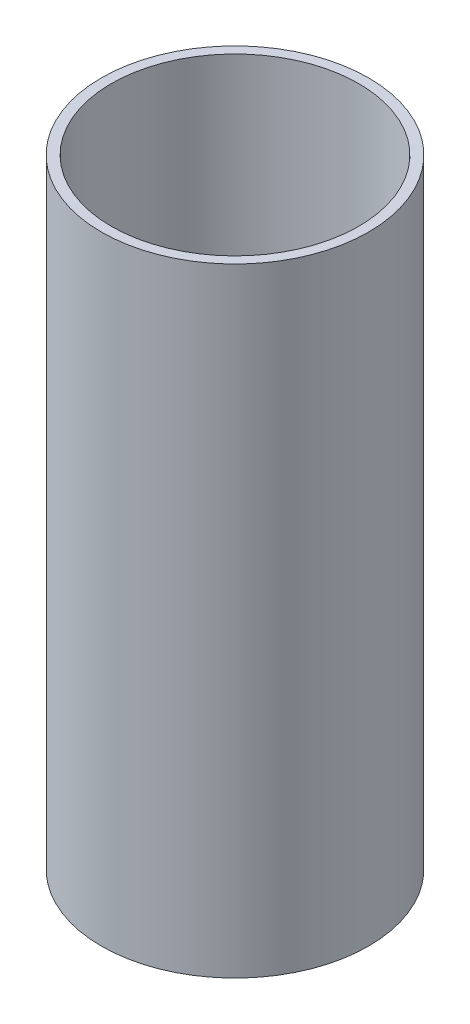
ISO-10303-21;
HEADER;
FILE_DESCRIPTION(('STEP AP214'),'2;1');
FILE_NAME('part.step','',(''),(''),'','','');
FILE_SCHEMA(('AUTOMOTIVE_DESIGN { 1 0 10303 214 1 1 1 1 }'));
ENDSEC;
DATA;
#1=APPLICATION_CONTEXT('core data for automotive mechanical design processes');
#2=APPLICATION_PROTOCOL_DEFINITION('international standard','automotive_design',2000,#1);
#3=PRODUCT_CONTEXT('',#1,'mechanical');
#4=PRODUCT('Part','Part','',(#3));
#5=PRODUCT_RELATED_PRODUCT_CATEGORY('part','',(#4));
#6=PRODUCT_DEFINITION_FORMATION('','',#4);
#7=PRODUCT_DEFINITION_CONTEXT('part definition',#1,'design');
#8=PRODUCT_DEFINITION('design','',#6,#7);
#9=PRODUCT_DEFINITION_SHAPE('','',#8);
#10=(LENGTH_UNIT() NAMED_UNIT(*) SI_UNIT(.MILLI.,.METRE.));
#11=(NAMED_UNIT(*) PLANE_ANGLE_UNIT() SI_UNIT($,.RADIAN.));
#12=(NAMED_UNIT(*) SI_UNIT($,.STERADIAN.) SOLID_ANGLE_UNIT());
#13=UNCERTAINTY_MEASURE_WITH_UNIT(LENGTH_MEASURE(1.E-05),#10,'distance_accuracy_value','');
#14=(GEOMETRIC_REPRESENTATION_CONTEXT(3) GLOBAL_UNCERTAINTY_ASSIGNED_CONTEXT((#13)) GLOBAL_UNIT_ASSIGNED_CONTEXT((#10,
#11,#12)) REPRESENTATION_CONTEXT('',''));
#15=CARTESIAN_POINT('',(0.,0.,0.));
#16=DIRECTION('',(0.,0.,1.));
#17=DIRECTION('',(1.,0.,0.));
#18=AXIS2_PLACEMENT_3D('',#15,#16,#17);
#19=CARTESIAN_POINT('',(0.,63.5,0.));
#20=DIRECTION('',(0.,1.,0.));
#21=DIRECTION('',(0.,0.,1.));
#22=AXIS2_PLACEMENT_3D('',#19,#20,#21);
#23=PLANE('',#22);
#24=CARTESIAN_POINT('',(0.,63.5,0.));
#25=DIRECTION('',(0.,1.,0.));
#26=DIRECTION('',(0.,0.,1.));
#27=AXIS2_PLACEMENT_3D('',#24,#25,#26);
#28=CIRCLE('',#27,13.716);
#29=CARTESIAN_POINT('',(0.,63.5,13.716));
#30=VERTEX_POINT('',#29);
#31=EDGE_CURVE('E10',#30,#30,#28,.T.);
#32=ORIENTED_EDGE('',*,*,#31,.T.);
#33=EDGE_LOOP('',(#32));
#34=FACE_BOUND('',#33,.T.);
#35=CARTESIAN_POINT('',(0.,63.5,0.));
#36=DIRECTION('',(0.,1.,0.));
#37=DIRECTION('',(0.,0.,1.));
#38=AXIS2_PLACEMENT_3D('',#35,#36,#37);
#39=CIRCLE('',#38,12.7);
#40=CARTESIAN_POINT('',(0.,63.5,12.7));
#41=VERTEX_POINT('',#40);
#42=EDGE_CURVE('E41',#41,#41,#39,.T.);
#43=ORIENTED_EDGE('',*,*,#42,.F.);
#44=EDGE_LOOP('',(#43));
#45=FACE_BOUND('',#44,.T.);
#46=ADVANCED_FACE('F30',(#34,#45),#23,.T.);
#47=CARTESIAN_POINT('',(0.,0.,0.));
#48=DIRECTION('',(0.,1.,0.));
#49=DIRECTION('',(0.,0.,1.));
#50=AXIS2_PLACEMENT_3D('',#47,#48,#49);
#51=PLANE('',#50);
#52=CARTESIAN_POINT('',(0.,0.,0.));
#53=DIRECTION('',(0.,1.,0.));
#54=DIRECTION('',(0.,0.,1.));
#55=AXIS2_PLACEMENT_3D('',#52,#53,#54);
#56=CIRCLE('',#55,13.716);
#57=CARTESIAN_POINT('',(0.,0.,13.716));
#58=VERTEX_POINT('',#57);
#59=EDGE_CURVE('E34',#58,#58,#56,.T.);
#60=ORIENTED_EDGE('',*,*,#59,.F.);
#61=EDGE_LOOP('',(#60));
#62=FACE_BOUND('',#61,.T.);
#63=CARTESIAN_POINT('',(0.,0.,0.));
#64=DIRECTION('',(0.,1.,0.));
#65=DIRECTION('',(0.,0.,1.));
#66=AXIS2_PLACEMENT_3D('',#63,#64,#65);
#67=CIRCLE('',#66,12.7);
#68=CARTESIAN_POINT('',(0.,0.,12.7));
#69=VERTEX_POINT('',#68);
#70=EDGE_CURVE('E43',#69,#69,#67,.T.);
#71=ORIENTED_EDGE('',*,*,#70,.T.);
#72=EDGE_LOOP('',(#71));
#73=FACE_BOUND('',#72,.T.);
#74=ADVANCED_FACE('F53',(#62,#73),#51,.F.);
#75=CARTESIAN_POINT('',(0.,63.5,0.));
#76=DIRECTION('',(0.,-1.,0.));
#77=DIRECTION('',(0.,0.,-1.));
#78=AXIS2_PLACEMENT_3D('',#75,#76,#77);
#79=CYLINDRICAL_SURFACE('',#78,13.716);
#80=ORIENTED_EDGE('',*,*,#31,.F.);
#81=EDGE_LOOP('',(#80));
#82=FACE_BOUND('',#81,.T.);
#83=ORIENTED_EDGE('',*,*,#59,.T.);
#84=EDGE_LOOP('',(#83));
#85=FACE_BOUND('',#84,.T.);
#86=ADVANCED_FACE('F32',(#82,#85),#79,.T.);
#87=CARTESIAN_POINT('',(0.,63.5,0.));
#88=DIRECTION('',(0.,-1.,0.));
#89=DIRECTION('',(0.,0.,-1.));
#90=AXIS2_PLACEMENT_3D('',#87,#88,#89);
#91=CYLINDRICAL_SURFACE('',#90,12.7);
#92=ORIENTED_EDGE('',*,*,#42,.T.);
#93=EDGE_LOOP('',(#92));
#94=FACE_BOUND('',#93,.T.);
#95=ORIENTED_EDGE('',*,*,#70,.F.);
#96=EDGE_LOOP('',(#95));
#97=FACE_BOUND('',#96,.T.);
#98=ADVANCED_FACE('F49',(#94,#97),#91,.F.);
#99=CLOSED_SHELL('',(#46,#74,#86,#98));
#100=MANIFOLD_SOLID_BREP('B2',#99);
#101=ADVANCED_BREP_SHAPE_REPRESENTATION('',(#18,#100),#14);
#102=SHAPE_DEFINITION_REPRESENTATION(#9,#101);
ENDSEC;
END-ISO-10303-21;
